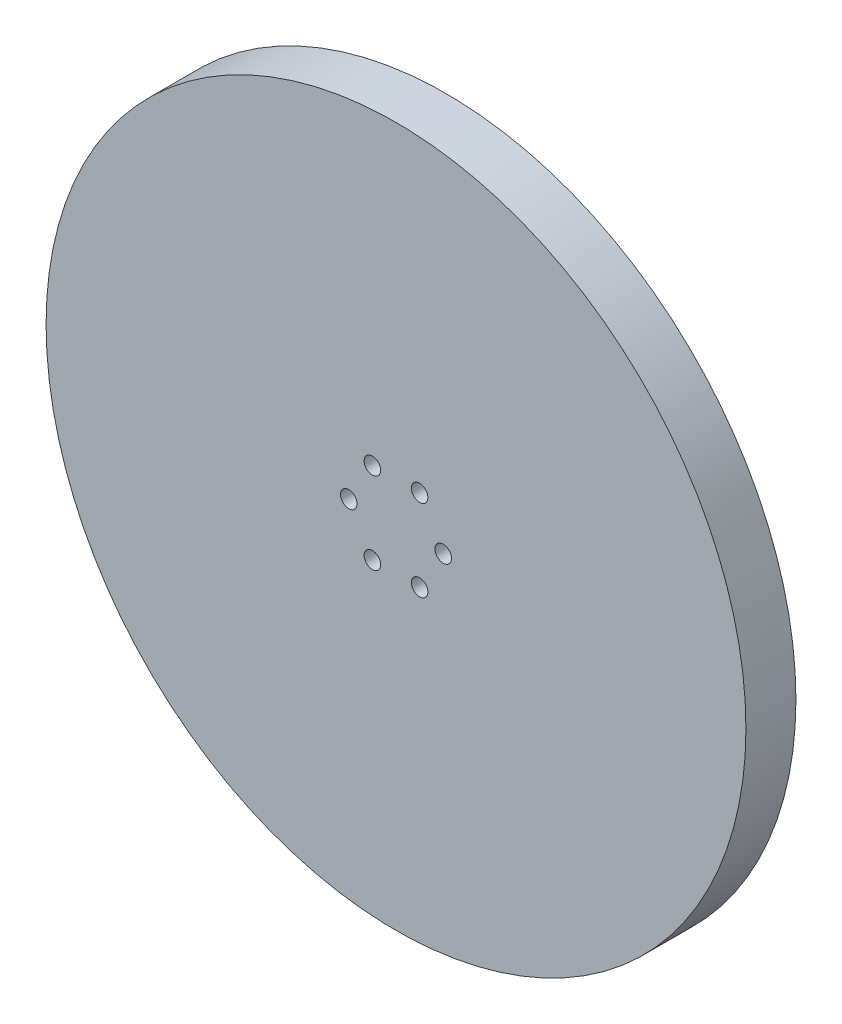
ISO-10303-21;
HEADER;
FILE_DESCRIPTION(('STEP AP214'),'2;1');
FILE_NAME('part.step','',(''),(''),'','','');
FILE_SCHEMA(('AUTOMOTIVE_DESIGN { 1 0 10303 214 1 1 1 1 }'));
ENDSEC;
DATA;
#1=APPLICATION_CONTEXT('core data for automotive mechanical design processes');
#2=APPLICATION_PROTOCOL_DEFINITION('international standard','automotive_design',2000,#1);
#3=PRODUCT_CONTEXT('',#1,'mechanical');
#4=PRODUCT('Part','Part','',(#3));
#5=PRODUCT_RELATED_PRODUCT_CATEGORY('part','',(#4));
#6=PRODUCT_DEFINITION_FORMATION('','',#4);
#7=PRODUCT_DEFINITION_CONTEXT('part definition',#1,'design');
#8=PRODUCT_DEFINITION('design','',#6,#7);
#9=PRODUCT_DEFINITION_SHAPE('','',#8);
#10=(LENGTH_UNIT() NAMED_UNIT(*) SI_UNIT(.MILLI.,.METRE.));
#11=(NAMED_UNIT(*) PLANE_ANGLE_UNIT() SI_UNIT($,.RADIAN.));
#12=(NAMED_UNIT(*) SI_UNIT($,.STERADIAN.) SOLID_ANGLE_UNIT());
#13=UNCERTAINTY_MEASURE_WITH_UNIT(LENGTH_MEASURE(1.E-05),#10,'distance_accuracy_value','');
#14=(GEOMETRIC_REPRESENTATION_CONTEXT(3) GLOBAL_UNCERTAINTY_ASSIGNED_CONTEXT((#13)) GLOBAL_UNIT_ASSIGNED_CONTEXT((#10,
#11,#12)) REPRESENTATION_CONTEXT('',''));
#15=CARTESIAN_POINT('',(0.,0.,0.));
#16=DIRECTION('',(0.,0.,1.));
#17=DIRECTION('',(1.,0.,0.));
#18=AXIS2_PLACEMENT_3D('',#15,#16,#17);
#19=CARTESIAN_POINT('',(-12.,0.,6.35));
#20=DIRECTION('',(0.,0.,-1.));
#21=DIRECTION('',(-1.,0.,0.));
#22=AXIS2_PLACEMENT_3D('',#19,#20,#21);
#23=CYLINDRICAL_SURFACE('',#22,2.1);
#24=CARTESIAN_POINT('',(-12.,0.,6.35));
#25=DIRECTION('',(0.,0.,1.));
#26=DIRECTION('',(1.,0.,0.));
#27=AXIS2_PLACEMENT_3D('',#24,#25,#26);
#28=CIRCLE('',#27,2.1);
#29=CARTESIAN_POINT('',(-9.9,0.,6.35));
#30=VERTEX_POINT('',#29);
#31=EDGE_CURVE('E49',#30,#30,#28,.T.);
#32=ORIENTED_EDGE('',*,*,#31,.T.);
#33=EDGE_LOOP('',(#32));
#34=FACE_BOUND('',#33,.T.);
#35=CARTESIAN_POINT('',(-12.,0.,-3.35));
#36=DIRECTION('',(0.,0.,-1.));
#37=DIRECTION('',(-1.,0.,0.));
#38=AXIS2_PLACEMENT_3D('',#35,#36,#37);
#39=CIRCLE('',#38,2.1);
#40=CARTESIAN_POINT('',(-14.1,0.,-3.35));
#41=VERTEX_POINT('',#40);
#42=EDGE_CURVE('E66',#41,#41,#39,.T.);
#43=ORIENTED_EDGE('',*,*,#42,.T.);
#44=EDGE_LOOP('',(#43));
#45=FACE_BOUND('',#44,.T.);
#46=ADVANCED_FACE('F40',(#34,#45),#23,.F.);
#47=CARTESIAN_POINT('',(-6.,10.3923048454133,6.35));
#48=DIRECTION('',(0.,0.,-1.));
#49=DIRECTION('',(-1.,0.,0.));
#50=AXIS2_PLACEMENT_3D('',#47,#48,#49);
#51=CYLINDRICAL_SURFACE('',#50,2.1);
#52=CARTESIAN_POINT('',(-6.,10.3923048454133,6.35));
#53=DIRECTION('',(0.,0.,1.));
#54=DIRECTION('',(1.,0.,0.));
#55=AXIS2_PLACEMENT_3D('',#52,#53,#54);
#56=CIRCLE('',#55,2.1);
#57=CARTESIAN_POINT('',(-3.9,10.3923048454133,6.35));
#58=VERTEX_POINT('',#57);
#59=EDGE_CURVE('E53',#58,#58,#56,.T.);
#60=ORIENTED_EDGE('',*,*,#59,.T.);
#61=EDGE_LOOP('',(#60));
#62=FACE_BOUND('',#61,.T.);
#63=CARTESIAN_POINT('',(-6.,10.3923048454133,-3.35));
#64=DIRECTION('',(0.,0.,-1.));
#65=DIRECTION('',(-1.,0.,0.));
#66=AXIS2_PLACEMENT_3D('',#63,#64,#65);
#67=CIRCLE('',#66,2.1);
#68=CARTESIAN_POINT('',(-8.1,10.3923048454133,-3.35));
#69=VERTEX_POINT('',#68);
#70=EDGE_CURVE('E75',#69,#69,#67,.T.);
#71=ORIENTED_EDGE('',*,*,#70,.T.);
#72=EDGE_LOOP('',(#71));
#73=FACE_BOUND('',#72,.T.);
#74=ADVANCED_FACE('F108',(#62,#73),#51,.F.);
#75=CARTESIAN_POINT('',(6.,10.3923048454133,6.35));
#76=DIRECTION('',(0.,0.,-1.));
#77=DIRECTION('',(-1.,0.,0.));
#78=AXIS2_PLACEMENT_3D('',#75,#76,#77);
#79=CYLINDRICAL_SURFACE('',#78,2.1);
#80=CARTESIAN_POINT('',(6.,10.3923048454133,6.35));
#81=DIRECTION('',(0.,0.,1.));
#82=DIRECTION('',(1.,0.,0.));
#83=AXIS2_PLACEMENT_3D('',#80,#81,#82);
#84=CIRCLE('',#83,2.1);
#85=CARTESIAN_POINT('',(8.1,10.3923048454133,6.35));
#86=VERTEX_POINT('',#85);
#87=EDGE_CURVE('E60',#86,#86,#84,.T.);
#88=ORIENTED_EDGE('',*,*,#87,.T.);
#89=EDGE_LOOP('',(#88));
#90=FACE_BOUND('',#89,.T.);
#91=CARTESIAN_POINT('',(6.,10.3923048454133,-3.35));
#92=DIRECTION('',(0.,0.,-1.));
#93=DIRECTION('',(-1.,0.,0.));
#94=AXIS2_PLACEMENT_3D('',#91,#92,#93);
#95=CIRCLE('',#94,2.1);
#96=CARTESIAN_POINT('',(3.9,10.3923048454133,-3.35));
#97=VERTEX_POINT('',#96);
#98=EDGE_CURVE('E73',#97,#97,#95,.T.);
#99=ORIENTED_EDGE('',*,*,#98,.T.);
#100=EDGE_LOOP('',(#99));
#101=FACE_BOUND('',#100,.T.);
#102=ADVANCED_FACE('F119',(#90,#101),#79,.F.);
#103=CARTESIAN_POINT('',(12.,0.,6.35));
#104=DIRECTION('',(0.,0.,-1.));
#105=DIRECTION('',(-1.,0.,0.));
#106=AXIS2_PLACEMENT_3D('',#103,#104,#105);
#107=CYLINDRICAL_SURFACE('',#106,2.1);
#108=CARTESIAN_POINT('',(12.,0.,6.35));
#109=DIRECTION('',(0.,0.,1.));
#110=DIRECTION('',(1.,0.,0.));
#111=AXIS2_PLACEMENT_3D('',#108,#109,#110);
#112=CIRCLE('',#111,2.1);
#113=CARTESIAN_POINT('',(14.1,0.,6.35));
#114=VERTEX_POINT('',#113);
#115=EDGE_CURVE('E58',#114,#114,#112,.T.);
#116=ORIENTED_EDGE('',*,*,#115,.T.);
#117=EDGE_LOOP('',(#116));
#118=FACE_BOUND('',#117,.T.);
#119=CARTESIAN_POINT('',(12.,0.,-3.35));
#120=DIRECTION('',(0.,0.,-1.));
#121=DIRECTION('',(-1.,0.,0.));
#122=AXIS2_PLACEMENT_3D('',#119,#120,#121);
#123=CIRCLE('',#122,2.1);
#124=CARTESIAN_POINT('',(9.9,0.,-3.35));
#125=VERTEX_POINT('',#124);
#126=EDGE_CURVE('E80',#125,#125,#123,.T.);
#127=ORIENTED_EDGE('',*,*,#126,.T.);
#128=EDGE_LOOP('',(#127));
#129=FACE_BOUND('',#128,.T.);
#130=ADVANCED_FACE('F170',(#118,#129),#107,.F.);
#131=CARTESIAN_POINT('',(6.00000000000001,-10.3923048454133,6.35));
#132=DIRECTION('',(0.,0.,-1.));
#133=DIRECTION('',(-1.,0.,0.));
#134=AXIS2_PLACEMENT_3D('',#131,#132,#133);
#135=CYLINDRICAL_SURFACE('',#134,2.1);
#136=CARTESIAN_POINT('',(6.00000000000001,-10.3923048454133,6.35));
#137=DIRECTION('',(0.,0.,1.));
#138=DIRECTION('',(1.,0.,0.));
#139=AXIS2_PLACEMENT_3D('',#136,#137,#138);
#140=CIRCLE('',#139,2.1);
#141=CARTESIAN_POINT('',(8.10000000000001,-10.3923048454133,6.35));
#142=VERTEX_POINT('',#141);
#143=EDGE_CURVE('E65',#142,#142,#140,.T.);
#144=ORIENTED_EDGE('',*,*,#143,.T.);
#145=EDGE_LOOP('',(#144));
#146=FACE_BOUND('',#145,.T.);
#147=CARTESIAN_POINT('',(6.00000000000001,-10.3923048454133,-3.35));
#148=DIRECTION('',(0.,0.,-1.));
#149=DIRECTION('',(-1.,0.,0.));
#150=AXIS2_PLACEMENT_3D('',#147,#148,#149);
#151=CIRCLE('',#150,2.1);
#152=CARTESIAN_POINT('',(3.9,-10.3923048454133,-3.35));
#153=VERTEX_POINT('',#152);
#154=EDGE_CURVE('E82',#153,#153,#151,.T.);
#155=ORIENTED_EDGE('',*,*,#154,.T.);
#156=EDGE_LOOP('',(#155));
#157=FACE_BOUND('',#156,.T.);
#158=ADVANCED_FACE('F160',(#146,#157),#135,.F.);
#159=CARTESIAN_POINT('',(-6.,-10.3923048454133,6.35));
#160=DIRECTION('',(0.,0.,-1.));
#161=DIRECTION('',(-1.,0.,0.));
#162=AXIS2_PLACEMENT_3D('',#159,#160,#161);
#163=CYLINDRICAL_SURFACE('',#162,2.1);
#164=CARTESIAN_POINT('',(-6.,-10.3923048454133,6.35));
#165=DIRECTION('',(0.,0.,1.));
#166=DIRECTION('',(1.,0.,0.));
#167=AXIS2_PLACEMENT_3D('',#164,#165,#166);
#168=CIRCLE('',#167,2.1);
#169=CARTESIAN_POINT('',(-3.9,-10.3923048454133,6.35));
#170=VERTEX_POINT('',#169);
#171=EDGE_CURVE('E67',#170,#170,#168,.T.);
#172=ORIENTED_EDGE('',*,*,#171,.T.);
#173=EDGE_LOOP('',(#172));
#174=FACE_BOUND('',#173,.T.);
#175=CARTESIAN_POINT('',(-6.,-10.3923048454133,-3.35));
#176=DIRECTION('',(0.,0.,-1.));
#177=DIRECTION('',(-1.,0.,0.));
#178=AXIS2_PLACEMENT_3D('',#175,#176,#177);
#179=CIRCLE('',#178,2.1);
#180=CARTESIAN_POINT('',(-8.1,-10.3923048454133,-3.35));
#181=VERTEX_POINT('',#180);
#182=EDGE_CURVE('E41',#181,#181,#179,.T.);
#183=ORIENTED_EDGE('',*,*,#182,.T.);
#184=EDGE_LOOP('',(#183));
#185=FACE_BOUND('',#184,.T.);
#186=ADVANCED_FACE('F94',(#174,#185),#163,.F.);
#187=CARTESIAN_POINT('',(0.,0.,6.35));
#188=DIRECTION('',(0.,0.,1.));
#189=DIRECTION('',(1.,0.,0.));
#190=AXIS2_PLACEMENT_3D('',#187,#188,#189);
#191=PLANE('',#190);
#192=ORIENTED_EDGE('',*,*,#143,.F.);
#193=EDGE_LOOP('',(#192));
#194=FACE_BOUND('',#193,.T.);
#195=ORIENTED_EDGE('',*,*,#87,.F.);
#196=EDGE_LOOP('',(#195));
#197=FACE_BOUND('',#196,.T.);
#198=ORIENTED_EDGE('',*,*,#31,.F.);
#199=EDGE_LOOP('',(#198));
#200=FACE_BOUND('',#199,.T.);
#201=CARTESIAN_POINT('',(0.,0.,6.35));
#202=DIRECTION('',(0.,0.,1.));
#203=DIRECTION('',(1.,0.,0.));
#204=AXIS2_PLACEMENT_3D('',#201,#202,#203);
#205=CIRCLE('',#204,88.9);
#206=CARTESIAN_POINT('',(88.9,0.,6.35));
#207=VERTEX_POINT('',#206);
#208=EDGE_CURVE('E10',#207,#207,#205,.T.);
#209=ORIENTED_EDGE('',*,*,#208,.T.);
#210=EDGE_LOOP('',(#209));
#211=FACE_BOUND('',#210,.T.);
#212=ORIENTED_EDGE('',*,*,#59,.F.);
#213=EDGE_LOOP('',(#212));
#214=FACE_BOUND('',#213,.T.);
#215=ORIENTED_EDGE('',*,*,#115,.F.);
#216=EDGE_LOOP('',(#215));
#217=FACE_BOUND('',#216,.T.);
#218=ORIENTED_EDGE('',*,*,#171,.F.);
#219=EDGE_LOOP('',(#218));
#220=FACE_BOUND('',#219,.T.);
#221=ADVANCED_FACE('F125',(#194,#197,#200,#211,#214,#217,#220),#191,.T.);
#222=CARTESIAN_POINT('',(0.,0.,-6.35));
#223=DIRECTION('',(0.,0.,1.));
#224=DIRECTION('',(1.,0.,0.));
#225=AXIS2_PLACEMENT_3D('',#222,#223,#224);
#226=PLANE('',#225);
#227=CARTESIAN_POINT('',(0.,0.,-6.35));
#228=DIRECTION('',(0.,0.,-1.));
#229=DIRECTION('',(-1.,0.,0.));
#230=AXIS2_PLACEMENT_3D('',#227,#228,#229);
#231=CIRCLE('',#230,57.3);
#232=CARTESIAN_POINT('',(-57.3,0.,-6.35));
#233=VERTEX_POINT('',#232);
#234=EDGE_CURVE('E81',#233,#233,#231,.T.);
#235=ORIENTED_EDGE('',*,*,#234,.F.);
#236=EDGE_LOOP('',(#235));
#237=FACE_BOUND('',#236,.T.);
#238=CARTESIAN_POINT('',(0.,0.,-6.35));
#239=DIRECTION('',(0.,0.,1.));
#240=DIRECTION('',(1.,0.,0.));
#241=AXIS2_PLACEMENT_3D('',#238,#239,#240);
#242=CIRCLE('',#241,88.9);
#243=CARTESIAN_POINT('',(88.9,0.,-6.35));
#244=VERTEX_POINT('',#243);
#245=EDGE_CURVE('E44',#244,#244,#242,.T.);
#246=ORIENTED_EDGE('',*,*,#245,.F.);
#247=EDGE_LOOP('',(#246));
#248=FACE_BOUND('',#247,.T.);
#249=ADVANCED_FACE('F121',(#237,#248),#226,.F.);
#250=CARTESIAN_POINT('',(0.,0.,6.35));
#251=DIRECTION('',(0.,0.,-1.));
#252=DIRECTION('',(-1.,0.,0.));
#253=AXIS2_PLACEMENT_3D('',#250,#251,#252);
#254=CYLINDRICAL_SURFACE('',#253,88.9);
#255=ORIENTED_EDGE('',*,*,#208,.F.);
#256=EDGE_LOOP('',(#255));
#257=FACE_BOUND('',#256,.T.);
#258=ORIENTED_EDGE('',*,*,#245,.T.);
#259=EDGE_LOOP('',(#258));
#260=FACE_BOUND('',#259,.T.);
#261=ADVANCED_FACE('F39',(#257,#260),#254,.T.);
#262=CARTESIAN_POINT('',(0.,0.,-3.35));
#263=DIRECTION('',(0.,0.,-1.));
#264=DIRECTION('',(-1.,0.,0.));
#265=AXIS2_PLACEMENT_3D('',#262,#263,#264);
#266=CYLINDRICAL_SURFACE('',#265,57.3);
#267=CARTESIAN_POINT('',(0.,0.,-3.35));
#268=DIRECTION('',(0.,0.,-1.));
#269=DIRECTION('',(-1.,0.,0.));
#270=AXIS2_PLACEMENT_3D('',#267,#268,#269);
#271=CIRCLE('',#270,57.3);
#272=CARTESIAN_POINT('',(-57.3,0.,-3.35));
#273=VERTEX_POINT('',#272);
#274=EDGE_CURVE('E87',#273,#273,#271,.T.);
#275=ORIENTED_EDGE('',*,*,#274,.F.);
#276=EDGE_LOOP('',(#275));
#277=FACE_BOUND('',#276,.T.);
#278=ORIENTED_EDGE('',*,*,#234,.T.);
#279=EDGE_LOOP('',(#278));
#280=FACE_BOUND('',#279,.T.);
#281=ADVANCED_FACE('F98',(#277,#280),#266,.F.);
#282=CARTESIAN_POINT('',(0.,0.,-3.35));
#283=DIRECTION('',(0.,0.,-1.));
#284=DIRECTION('',(-1.,0.,0.));
#285=AXIS2_PLACEMENT_3D('',#282,#283,#284);
#286=PLANE('',#285);
#287=ORIENTED_EDGE('',*,*,#42,.F.);
#288=EDGE_LOOP('',(#287));
#289=FACE_BOUND('',#288,.T.);
#290=ORIENTED_EDGE('',*,*,#70,.F.);
#291=EDGE_LOOP('',(#290));
#292=FACE_BOUND('',#291,.T.);
#293=ORIENTED_EDGE('',*,*,#98,.F.);
#294=EDGE_LOOP('',(#293));
#295=FACE_BOUND('',#294,.T.);
#296=ORIENTED_EDGE('',*,*,#126,.F.);
#297=EDGE_LOOP('',(#296));
#298=FACE_BOUND('',#297,.T.);
#299=ORIENTED_EDGE('',*,*,#154,.F.);
#300=EDGE_LOOP('',(#299));
#301=FACE_BOUND('',#300,.T.);
#302=ORIENTED_EDGE('',*,*,#182,.F.);
#303=EDGE_LOOP('',(#302));
#304=FACE_BOUND('',#303,.T.);
#305=ORIENTED_EDGE('',*,*,#274,.T.);
#306=EDGE_LOOP('',(#305));
#307=FACE_BOUND('',#306,.T.);
#308=ADVANCED_FACE('F96',(#289,#292,#295,#298,#301,#304,#307),#286,.T.);
#309=CLOSED_SHELL('',(#46,#74,#102,#130,#158,#186,#221,#249,#261,#281,#308));
#310=MANIFOLD_SOLID_BREP('B2',#309);
#311=ADVANCED_BREP_SHAPE_REPRESENTATION('',(#18,#310),#14);
#312=SHAPE_DEFINITION_REPRESENTATION(#9,#311);
ENDSEC;
END-ISO-10303-21;
